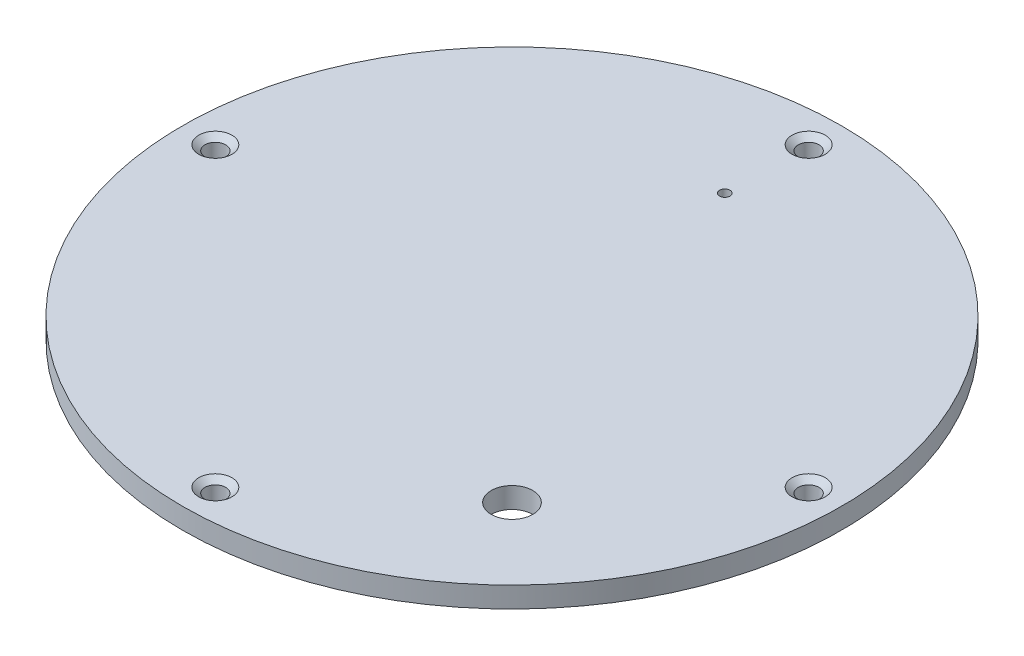
ISO-10303-21;
HEADER;
FILE_DESCRIPTION(('STEP AP214'),'2;1');
FILE_NAME('part.step','',(''),(''),'','','');
FILE_SCHEMA(('AUTOMOTIVE_DESIGN { 1 0 10303 214 1 1 1 1 }'));
ENDSEC;
DATA;
#1=APPLICATION_CONTEXT('core data for automotive mechanical design processes');
#2=APPLICATION_PROTOCOL_DEFINITION('international standard','automotive_design',2000,#1);
#3=PRODUCT_CONTEXT('',#1,'mechanical');
#4=PRODUCT('Part','Part','',(#3));
#5=PRODUCT_RELATED_PRODUCT_CATEGORY('part','',(#4));
#6=PRODUCT_DEFINITION_FORMATION('','',#4);
#7=PRODUCT_DEFINITION_CONTEXT('part definition',#1,'design');
#8=PRODUCT_DEFINITION('design','',#6,#7);
#9=PRODUCT_DEFINITION_SHAPE('','',#8);
#10=(LENGTH_UNIT() NAMED_UNIT(*) SI_UNIT(.MILLI.,.METRE.));
#11=(NAMED_UNIT(*) PLANE_ANGLE_UNIT() SI_UNIT($,.RADIAN.));
#12=(NAMED_UNIT(*) SI_UNIT($,.STERADIAN.) SOLID_ANGLE_UNIT());
#13=UNCERTAINTY_MEASURE_WITH_UNIT(LENGTH_MEASURE(1.E-05),#10,'distance_accuracy_value','');
#14=(GEOMETRIC_REPRESENTATION_CONTEXT(3) GLOBAL_UNCERTAINTY_ASSIGNED_CONTEXT((#13)) GLOBAL_UNIT_ASSIGNED_CONTEXT((#10,
#11,#12)) REPRESENTATION_CONTEXT('',''));
#15=CARTESIAN_POINT('',(0.,0.,0.));
#16=DIRECTION('',(0.,0.,1.));
#17=DIRECTION('',(1.,0.,0.));
#18=AXIS2_PLACEMENT_3D('',#15,#16,#17);
#19=CARTESIAN_POINT('',(0.,1.,0.));
#20=DIRECTION('',(0.,-1.,0.));
#21=DIRECTION('',(0.,0.,-1.));
#22=AXIS2_PLACEMENT_3D('',#19,#20,#21);
#23=CYLINDRICAL_SURFACE('',#22,15.875);
#24=CARTESIAN_POINT('',(0.,1.,0.));
#25=DIRECTION('',(0.,1.,0.));
#26=DIRECTION('',(0.,0.,1.));
#27=AXIS2_PLACEMENT_3D('',#24,#25,#26);
#28=CIRCLE('',#27,15.875);
#29=CARTESIAN_POINT('',(0.,1.,15.875));
#30=VERTEX_POINT('',#29);
#31=EDGE_CURVE('E10',#30,#30,#28,.T.);
#32=ORIENTED_EDGE('',*,*,#31,.F.);
#33=EDGE_LOOP('',(#32));
#34=FACE_BOUND('',#33,.T.);
#35=CARTESIAN_POINT('',(0.,0.,0.));
#36=DIRECTION('',(0.,1.,0.));
#37=DIRECTION('',(0.,0.,1.));
#38=AXIS2_PLACEMENT_3D('',#35,#36,#37);
#39=CIRCLE('',#38,15.875);
#40=CARTESIAN_POINT('',(0.,0.,15.875));
#41=VERTEX_POINT('',#40);
#42=EDGE_CURVE('E35',#41,#41,#39,.T.);
#43=ORIENTED_EDGE('',*,*,#42,.T.);
#44=EDGE_LOOP('',(#43));
#45=FACE_BOUND('',#44,.T.);
#46=ADVANCED_FACE('F32',(#34,#45),#23,.T.);
#47=CARTESIAN_POINT('',(0.,1.,0.));
#48=DIRECTION('',(0.,1.,0.));
#49=DIRECTION('',(0.,0.,1.));
#50=AXIS2_PLACEMENT_3D('',#47,#48,#49);
#51=PLANE('',#50);
#52=CARTESIAN_POINT('',(0.,1.,-14.29));
#53=DIRECTION('',(0.,1.,0.));
#54=DIRECTION('',(0.,0.,1.));
#55=AXIS2_PLACEMENT_3D('',#52,#53,#54);
#56=CIRCLE('',#55,0.8);
#57=CARTESIAN_POINT('',(0.,1.,-13.49));
#58=VERTEX_POINT('',#57);
#59=EDGE_CURVE('E88',#58,#58,#56,.T.);
#60=ORIENTED_EDGE('',*,*,#59,.F.);
#61=EDGE_LOOP('',(#60));
#62=FACE_BOUND('',#61,.T.);
#63=CARTESIAN_POINT('',(-14.29,1.,0.));
#64=DIRECTION('',(0.,1.,0.));
#65=DIRECTION('',(0.,0.,1.));
#66=AXIS2_PLACEMENT_3D('',#63,#64,#65);
#67=CIRCLE('',#66,0.8);
#68=CARTESIAN_POINT('',(-14.29,1.,0.8));
#69=VERTEX_POINT('',#68);
#70=EDGE_CURVE('E79',#69,#69,#67,.T.);
#71=ORIENTED_EDGE('',*,*,#70,.F.);
#72=EDGE_LOOP('',(#71));
#73=FACE_BOUND('',#72,.T.);
#74=CARTESIAN_POINT('',(0.,1.,14.29));
#75=DIRECTION('',(0.,1.,0.));
#76=DIRECTION('',(0.,0.,1.));
#77=AXIS2_PLACEMENT_3D('',#74,#75,#76);
#78=CIRCLE('',#77,0.8);
#79=CARTESIAN_POINT('',(0.,1.,15.09));
#80=VERTEX_POINT('',#79);
#81=EDGE_CURVE('E70',#80,#80,#78,.T.);
#82=ORIENTED_EDGE('',*,*,#81,.F.);
#83=EDGE_LOOP('',(#82));
#84=FACE_BOUND('',#83,.T.);
#85=CARTESIAN_POINT('',(14.29,1.,0.));
#86=DIRECTION('',(0.,1.,0.));
#87=DIRECTION('',(0.,0.,1.));
#88=AXIS2_PLACEMENT_3D('',#85,#86,#87);
#89=CIRCLE('',#88,0.8);
#90=CARTESIAN_POINT('',(14.29,1.,0.8));
#91=VERTEX_POINT('',#90);
#92=EDGE_CURVE('E61',#91,#91,#89,.T.);
#93=ORIENTED_EDGE('',*,*,#92,.F.);
#94=EDGE_LOOP('',(#93));
#95=FACE_BOUND('',#94,.T.);
#96=CARTESIAN_POINT('',(0.,1.,-10.25));
#97=DIRECTION('',(0.,1.,0.));
#98=DIRECTION('',(0.,0.,1.));
#99=AXIS2_PLACEMENT_3D('',#96,#97,#98);
#100=CIRCLE('',#99,0.25);
#101=CARTESIAN_POINT('',(0.,1.,-10.));
#102=VERTEX_POINT('',#101);
#103=EDGE_CURVE('E42',#102,#102,#100,.T.);
#104=ORIENTED_EDGE('',*,*,#103,.F.);
#105=EDGE_LOOP('',(#104));
#106=FACE_BOUND('',#105,.T.);
#107=CARTESIAN_POINT('',(7.77817459305202,1.,7.77817459305202));
#108=DIRECTION('',(0.,1.,0.));
#109=DIRECTION('',(0.,0.,1.));
#110=AXIS2_PLACEMENT_3D('',#107,#108,#109);
#111=CIRCLE('',#110,1.);
#112=CARTESIAN_POINT('',(7.77817459305202,1.,8.77817459305202));
#113=VERTEX_POINT('',#112);
#114=EDGE_CURVE('E46',#113,#113,#111,.T.);
#115=ORIENTED_EDGE('',*,*,#114,.F.);
#116=EDGE_LOOP('',(#115));
#117=FACE_BOUND('',#116,.T.);
#118=ORIENTED_EDGE('',*,*,#31,.T.);
#119=EDGE_LOOP('',(#118));
#120=FACE_BOUND('',#119,.T.);
#121=ADVANCED_FACE('F94',(#62,#73,#84,#95,#106,#117,#120),#51,.T.);
#122=CARTESIAN_POINT('',(0.,0.,0.));
#123=DIRECTION('',(0.,1.,0.));
#124=DIRECTION('',(0.,0.,1.));
#125=AXIS2_PLACEMENT_3D('',#122,#123,#124);
#126=PLANE('',#125);
#127=CARTESIAN_POINT('',(0.,0.,-14.29));
#128=DIRECTION('',(0.,1.,0.));
#129=DIRECTION('',(0.,0.,1.));
#130=AXIS2_PLACEMENT_3D('',#127,#128,#129);
#131=CIRCLE('',#130,0.499999999999988);
#132=CARTESIAN_POINT('',(0.,0.,-13.79));
#133=VERTEX_POINT('',#132);
#134=EDGE_CURVE('E82',#133,#133,#131,.T.);
#135=ORIENTED_EDGE('',*,*,#134,.T.);
#136=EDGE_LOOP('',(#135));
#137=FACE_BOUND('',#136,.T.);
#138=CARTESIAN_POINT('',(-14.29,0.,0.));
#139=DIRECTION('',(0.,1.,0.));
#140=DIRECTION('',(0.,0.,1.));
#141=AXIS2_PLACEMENT_3D('',#138,#139,#140);
#142=CIRCLE('',#141,0.499999999999988);
#143=CARTESIAN_POINT('',(-14.29,0.,0.499999999999988));
#144=VERTEX_POINT('',#143);
#145=EDGE_CURVE('E73',#144,#144,#142,.T.);
#146=ORIENTED_EDGE('',*,*,#145,.T.);
#147=EDGE_LOOP('',(#146));
#148=FACE_BOUND('',#147,.T.);
#149=CARTESIAN_POINT('',(0.,0.,14.29));
#150=DIRECTION('',(0.,1.,0.));
#151=DIRECTION('',(0.,0.,1.));
#152=AXIS2_PLACEMENT_3D('',#149,#150,#151);
#153=CIRCLE('',#152,0.499999999999988);
#154=CARTESIAN_POINT('',(0.,0.,14.79));
#155=VERTEX_POINT('',#154);
#156=EDGE_CURVE('E64',#155,#155,#153,.T.);
#157=ORIENTED_EDGE('',*,*,#156,.T.);
#158=EDGE_LOOP('',(#157));
#159=FACE_BOUND('',#158,.T.);
#160=CARTESIAN_POINT('',(14.29,0.,0.));
#161=DIRECTION('',(0.,1.,0.));
#162=DIRECTION('',(0.,0.,1.));
#163=AXIS2_PLACEMENT_3D('',#160,#161,#162);
#164=CIRCLE('',#163,0.499999999999988);
#165=CARTESIAN_POINT('',(14.29,0.,0.499999999999988));
#166=VERTEX_POINT('',#165);
#167=EDGE_CURVE('E53',#166,#166,#164,.T.);
#168=ORIENTED_EDGE('',*,*,#167,.T.);
#169=EDGE_LOOP('',(#168));
#170=FACE_BOUND('',#169,.T.);
#171=CARTESIAN_POINT('',(0.,0.,-10.25));
#172=DIRECTION('',(0.,1.,0.));
#173=DIRECTION('',(0.,0.,1.));
#174=AXIS2_PLACEMENT_3D('',#171,#172,#173);
#175=CIRCLE('',#174,0.25);
#176=CARTESIAN_POINT('',(0.,0.,-10.));
#177=VERTEX_POINT('',#176);
#178=EDGE_CURVE('E49',#177,#177,#175,.T.);
#179=ORIENTED_EDGE('',*,*,#178,.T.);
#180=EDGE_LOOP('',(#179));
#181=FACE_BOUND('',#180,.T.);
#182=CARTESIAN_POINT('',(7.77817459305202,0.,7.77817459305202));
#183=DIRECTION('',(0.,1.,0.));
#184=DIRECTION('',(0.,0.,1.));
#185=AXIS2_PLACEMENT_3D('',#182,#183,#184);
#186=CIRCLE('',#185,1.);
#187=CARTESIAN_POINT('',(7.77817459305202,0.,8.77817459305202));
#188=VERTEX_POINT('',#187);
#189=EDGE_CURVE('E50',#188,#188,#186,.T.);
#190=ORIENTED_EDGE('',*,*,#189,.T.);
#191=EDGE_LOOP('',(#190));
#192=FACE_BOUND('',#191,.T.);
#193=ORIENTED_EDGE('',*,*,#42,.F.);
#194=EDGE_LOOP('',(#193));
#195=FACE_BOUND('',#194,.T.);
#196=ADVANCED_FACE('F97',(#137,#148,#159,#170,#181,#192,#195),#126,.F.);
#197=CARTESIAN_POINT('',(7.77817459305202,0.,7.77817459305202));
#198=DIRECTION('',(0.,1.,0.));
#199=DIRECTION('',(0.,0.,1.));
#200=AXIS2_PLACEMENT_3D('',#197,#198,#199);
#201=CYLINDRICAL_SURFACE('',#200,1.);
#202=ORIENTED_EDGE('',*,*,#114,.T.);
#203=EDGE_LOOP('',(#202));
#204=FACE_BOUND('',#203,.T.);
#205=ORIENTED_EDGE('',*,*,#189,.F.);
#206=EDGE_LOOP('',(#205));
#207=FACE_BOUND('',#206,.T.);
#208=ADVANCED_FACE('F109',(#204,#207),#201,.F.);
#209=CARTESIAN_POINT('',(0.,0.,-10.25));
#210=DIRECTION('',(0.,1.,0.));
#211=DIRECTION('',(0.,0.,1.));
#212=AXIS2_PLACEMENT_3D('',#209,#210,#211);
#213=CYLINDRICAL_SURFACE('',#212,0.25);
#214=ORIENTED_EDGE('',*,*,#103,.T.);
#215=EDGE_LOOP('',(#214));
#216=FACE_BOUND('',#215,.T.);
#217=ORIENTED_EDGE('',*,*,#178,.F.);
#218=EDGE_LOOP('',(#217));
#219=FACE_BOUND('',#218,.T.);
#220=ADVANCED_FACE('F112',(#216,#219),#213,.F.);
#221=CARTESIAN_POINT('',(14.29,1.,0.));
#222=DIRECTION('',(0.,1.,0.));
#223=DIRECTION('',(0.,0.,1.));
#224=AXIS2_PLACEMENT_3D('',#221,#222,#223);
#225=CYLINDRICAL_SURFACE('',#224,0.499999999999994);
#226=ORIENTED_EDGE('',*,*,#167,.F.);
#227=EDGE_LOOP('',(#226));
#228=FACE_BOUND('',#227,.T.);
#229=CARTESIAN_POINT('',(14.29,0.748270110646816,0.));
#230=DIRECTION('',(0.,1.,0.));
#231=DIRECTION('',(0.,0.,1.));
#232=AXIS2_PLACEMENT_3D('',#229,#230,#231);
#233=CIRCLE('',#232,0.5);
#234=CARTESIAN_POINT('',(14.29,0.748270110646816,0.5));
#235=VERTEX_POINT('',#234);
#236=EDGE_CURVE('E58',#235,#235,#233,.T.);
#237=ORIENTED_EDGE('',*,*,#236,.T.);
#238=EDGE_LOOP('',(#237));
#239=FACE_BOUND('',#238,.T.);
#240=ADVANCED_FACE('F144',(#228,#239),#225,.F.);
#241=CARTESIAN_POINT('',(14.29,1.,0.));
#242=DIRECTION('',(0.,1.,0.));
#243=DIRECTION('',(0.,0.,1.));
#244=AXIS2_PLACEMENT_3D('',#241,#242,#243);
#245=CONICAL_SURFACE('',#244,0.8,0.872664625997164);
#246=ORIENTED_EDGE('',*,*,#236,.F.);
#247=EDGE_LOOP('',(#246));
#248=FACE_BOUND('',#247,.T.);
#249=ORIENTED_EDGE('',*,*,#92,.T.);
#250=EDGE_LOOP('',(#249));
#251=FACE_BOUND('',#250,.T.);
#252=ADVANCED_FACE('F151',(#248,#251),#245,.F.);
#253=CARTESIAN_POINT('',(0.,1.,14.29));
#254=DIRECTION('',(0.,1.,0.));
#255=DIRECTION('',(0.,0.,1.));
#256=AXIS2_PLACEMENT_3D('',#253,#254,#255);
#257=CYLINDRICAL_SURFACE('',#256,0.499999999999994);
#258=ORIENTED_EDGE('',*,*,#156,.F.);
#259=EDGE_LOOP('',(#258));
#260=FACE_BOUND('',#259,.T.);
#261=CARTESIAN_POINT('',(0.,0.748270110646816,14.29));
#262=DIRECTION('',(0.,1.,0.));
#263=DIRECTION('',(0.,0.,1.));
#264=AXIS2_PLACEMENT_3D('',#261,#262,#263);
#265=CIRCLE('',#264,0.5);
#266=CARTESIAN_POINT('',(0.,0.748270110646816,14.79));
#267=VERTEX_POINT('',#266);
#268=EDGE_CURVE('E67',#267,#267,#265,.T.);
#269=ORIENTED_EDGE('',*,*,#268,.T.);
#270=EDGE_LOOP('',(#269));
#271=FACE_BOUND('',#270,.T.);
#272=ADVANCED_FACE('F159',(#260,#271),#257,.F.);
#273=CARTESIAN_POINT('',(0.,1.,14.29));
#274=DIRECTION('',(0.,1.,0.));
#275=DIRECTION('',(0.,0.,1.));
#276=AXIS2_PLACEMENT_3D('',#273,#274,#275);
#277=CONICAL_SURFACE('',#276,0.8,0.872664625997165);
#278=ORIENTED_EDGE('',*,*,#268,.F.);
#279=EDGE_LOOP('',(#278));
#280=FACE_BOUND('',#279,.T.);
#281=ORIENTED_EDGE('',*,*,#81,.T.);
#282=EDGE_LOOP('',(#281));
#283=FACE_BOUND('',#282,.T.);
#284=ADVANCED_FACE('F167',(#280,#283),#277,.F.);
#285=CARTESIAN_POINT('',(-14.29,1.,0.));
#286=DIRECTION('',(0.,1.,0.));
#287=DIRECTION('',(0.,0.,1.));
#288=AXIS2_PLACEMENT_3D('',#285,#286,#287);
#289=CYLINDRICAL_SURFACE('',#288,0.499999999999994);
#290=ORIENTED_EDGE('',*,*,#145,.F.);
#291=EDGE_LOOP('',(#290));
#292=FACE_BOUND('',#291,.T.);
#293=CARTESIAN_POINT('',(-14.29,0.748270110646816,0.));
#294=DIRECTION('',(0.,1.,0.));
#295=DIRECTION('',(0.,0.,1.));
#296=AXIS2_PLACEMENT_3D('',#293,#294,#295);
#297=CIRCLE('',#296,0.5);
#298=CARTESIAN_POINT('',(-14.29,0.748270110646816,0.5));
#299=VERTEX_POINT('',#298);
#300=EDGE_CURVE('E76',#299,#299,#297,.T.);
#301=ORIENTED_EDGE('',*,*,#300,.T.);
#302=EDGE_LOOP('',(#301));
#303=FACE_BOUND('',#302,.T.);
#304=ADVANCED_FACE('F175',(#292,#303),#289,.F.);
#305=CARTESIAN_POINT('',(-14.29,1.,0.));
#306=DIRECTION('',(0.,1.,0.));
#307=DIRECTION('',(0.,0.,1.));
#308=AXIS2_PLACEMENT_3D('',#305,#306,#307);
#309=CONICAL_SURFACE('',#308,0.8,0.872664625997164);
#310=ORIENTED_EDGE('',*,*,#300,.F.);
#311=EDGE_LOOP('',(#310));
#312=FACE_BOUND('',#311,.T.);
#313=ORIENTED_EDGE('',*,*,#70,.T.);
#314=EDGE_LOOP('',(#313));
#315=FACE_BOUND('',#314,.T.);
#316=ADVANCED_FACE('F183',(#312,#315),#309,.F.);
#317=CARTESIAN_POINT('',(0.,1.,-14.29));
#318=DIRECTION('',(0.,1.,0.));
#319=DIRECTION('',(0.,0.,1.));
#320=AXIS2_PLACEMENT_3D('',#317,#318,#319);
#321=CYLINDRICAL_SURFACE('',#320,0.499999999999994);
#322=ORIENTED_EDGE('',*,*,#134,.F.);
#323=EDGE_LOOP('',(#322));
#324=FACE_BOUND('',#323,.T.);
#325=CARTESIAN_POINT('',(0.,0.748270110646816,-14.29));
#326=DIRECTION('',(0.,1.,0.));
#327=DIRECTION('',(0.,0.,1.));
#328=AXIS2_PLACEMENT_3D('',#325,#326,#327);
#329=CIRCLE('',#328,0.5);
#330=CARTESIAN_POINT('',(0.,0.748270110646816,-13.79));
#331=VERTEX_POINT('',#330);
#332=EDGE_CURVE('E85',#331,#331,#329,.T.);
#333=ORIENTED_EDGE('',*,*,#332,.T.);
#334=EDGE_LOOP('',(#333));
#335=FACE_BOUND('',#334,.T.);
#336=ADVANCED_FACE('F191',(#324,#335),#321,.F.);
#337=CARTESIAN_POINT('',(0.,1.,-14.29));
#338=DIRECTION('',(0.,1.,0.));
#339=DIRECTION('',(0.,0.,1.));
#340=AXIS2_PLACEMENT_3D('',#337,#338,#339);
#341=CONICAL_SURFACE('',#340,0.8,0.872664625997165);
#342=ORIENTED_EDGE('',*,*,#332,.F.);
#343=EDGE_LOOP('',(#342));
#344=FACE_BOUND('',#343,.T.);
#345=ORIENTED_EDGE('',*,*,#59,.T.);
#346=EDGE_LOOP('',(#345));
#347=FACE_BOUND('',#346,.T.);
#348=ADVANCED_FACE('F92',(#344,#347),#341,.F.);
#349=CLOSED_SHELL('',(#46,#121,#196,#208,#220,#240,#252,#272,#284,#304,#316,#336,#348));
#350=MANIFOLD_SOLID_BREP('B2',#349);
#351=ADVANCED_BREP_SHAPE_REPRESENTATION('',(#18,#350),#14);
#352=SHAPE_DEFINITION_REPRESENTATION(#9,#351);
ENDSEC;
END-ISO-10303-21;
